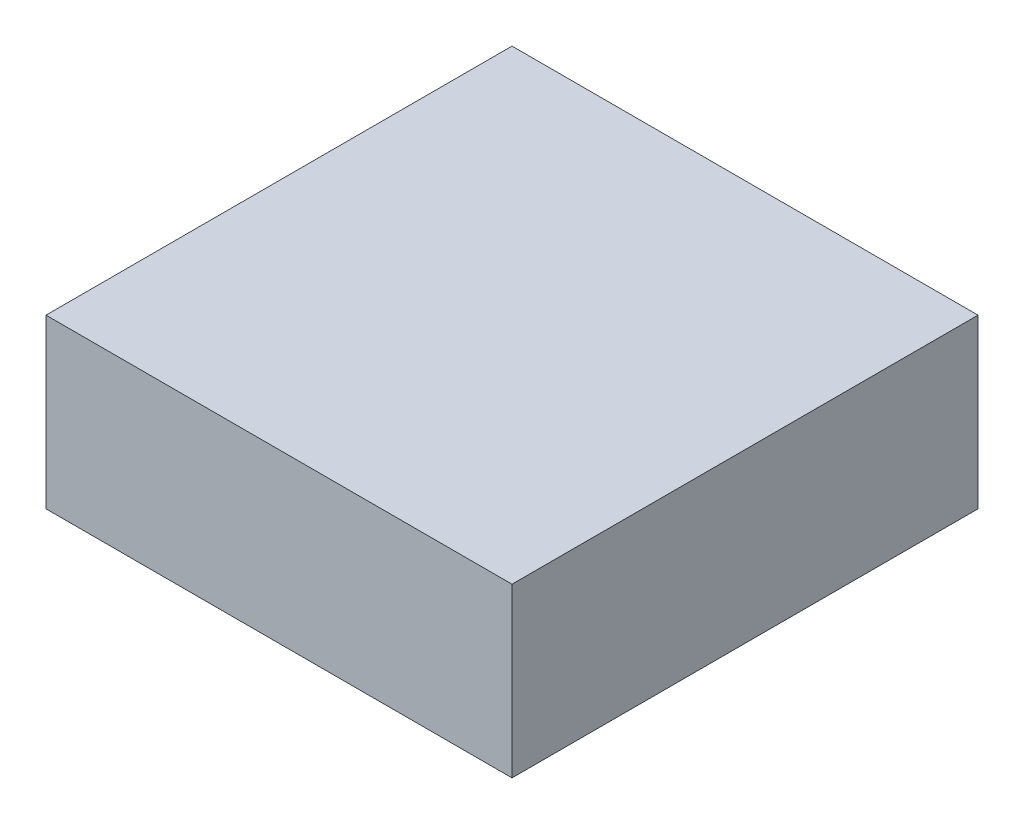
ISO-10303-21;
HEADER;
FILE_DESCRIPTION(('STEP AP214'),'2;1');
FILE_NAME('part.step','',(''),(''),'','','');
FILE_SCHEMA(('AUTOMOTIVE_DESIGN { 1 0 10303 214 1 1 1 1 }'));
ENDSEC;
DATA;
#1=APPLICATION_CONTEXT('core data for automotive mechanical design processes');
#2=APPLICATION_PROTOCOL_DEFINITION('international standard','automotive_design',2000,#1);
#3=PRODUCT_CONTEXT('',#1,'mechanical');
#4=PRODUCT('Part','Part','',(#3));
#5=PRODUCT_RELATED_PRODUCT_CATEGORY('part','',(#4));
#6=PRODUCT_DEFINITION_FORMATION('','',#4);
#7=PRODUCT_DEFINITION_CONTEXT('part definition',#1,'design');
#8=PRODUCT_DEFINITION('design','',#6,#7);
#9=PRODUCT_DEFINITION_SHAPE('','',#8);
#10=(LENGTH_UNIT() NAMED_UNIT(*) SI_UNIT(.MILLI.,.METRE.));
#11=(NAMED_UNIT(*) PLANE_ANGLE_UNIT() SI_UNIT($,.RADIAN.));
#12=(NAMED_UNIT(*) SI_UNIT($,.STERADIAN.) SOLID_ANGLE_UNIT());
#13=UNCERTAINTY_MEASURE_WITH_UNIT(LENGTH_MEASURE(1.E-05),#10,'distance_accuracy_value','');
#14=(GEOMETRIC_REPRESENTATION_CONTEXT(3) GLOBAL_UNCERTAINTY_ASSIGNED_CONTEXT((#13)) GLOBAL_UNIT_ASSIGNED_CONTEXT((#10,
#11,#12)) REPRESENTATION_CONTEXT('',''));
#15=CARTESIAN_POINT('',(0.,0.,0.));
#16=DIRECTION('',(0.,0.,1.));
#17=DIRECTION('',(1.,0.,0.));
#18=AXIS2_PLACEMENT_3D('',#15,#16,#17);
#19=CARTESIAN_POINT('',(12.5,9.,12.5));
#20=DIRECTION('',(-1.,0.,0.));
#21=DIRECTION('',(0.,0.,1.));
#22=AXIS2_PLACEMENT_3D('',#19,#20,#21);
#23=PLANE('',#22);
#24=DIRECTION('',(0.,0.,-1.));
#25=VECTOR('',#24,1.);
#26=CARTESIAN_POINT('',(12.5,0.,12.5));
#27=LINE('',#26,#25);
#28=CARTESIAN_POINT('',(12.5,0.,12.5));
#29=VERTEX_POINT('',#28);
#30=CARTESIAN_POINT('',(12.5,0.,-12.5));
#31=VERTEX_POINT('',#30);
#32=EDGE_CURVE('E96',#29,#31,#27,.T.);
#33=ORIENTED_EDGE('',*,*,#32,.T.);
#34=DIRECTION('',(0.,-1.,0.));
#35=VECTOR('',#34,1.);
#36=CARTESIAN_POINT('',(12.5,9.,-12.5));
#37=LINE('',#36,#35);
#38=CARTESIAN_POINT('',(12.5,9.,-12.5));
#39=VERTEX_POINT('',#38);
#40=EDGE_CURVE('E11',#39,#31,#37,.T.);
#41=ORIENTED_EDGE('',*,*,#40,.F.);
#42=DIRECTION('',(0.,0.,-1.));
#43=VECTOR('',#42,1.);
#44=CARTESIAN_POINT('',(12.5,9.,12.5));
#45=LINE('',#44,#43);
#46=CARTESIAN_POINT('',(12.5,9.,12.5));
#47=VERTEX_POINT('',#46);
#48=EDGE_CURVE('E84',#47,#39,#45,.T.);
#49=ORIENTED_EDGE('',*,*,#48,.F.);
#50=DIRECTION('',(0.,-1.,0.));
#51=VECTOR('',#50,1.);
#52=CARTESIAN_POINT('',(12.5,9.,12.5));
#53=LINE('',#52,#51);
#54=EDGE_CURVE('E92',#47,#29,#53,.T.);
#55=ORIENTED_EDGE('',*,*,#54,.T.);
#56=EDGE_LOOP('',(#33,#41,#49,#55));
#57=FACE_BOUND('',#56,.T.);
#58=ADVANCED_FACE('F33',(#57),#23,.F.);
#59=CARTESIAN_POINT('',(-12.5,9.,-12.5));
#60=DIRECTION('',(0.,0.,1.));
#61=DIRECTION('',(1.,0.,0.));
#62=AXIS2_PLACEMENT_3D('',#59,#60,#61);
#63=PLANE('',#62);
#64=DIRECTION('',(-1.,0.,0.));
#65=VECTOR('',#64,1.);
#66=CARTESIAN_POINT('',(-12.5,0.,-12.5));
#67=LINE('',#66,#65);
#68=CARTESIAN_POINT('',(-12.5,0.,-12.5));
#69=VERTEX_POINT('',#68);
#70=EDGE_CURVE('E88',#31,#69,#67,.T.);
#71=ORIENTED_EDGE('',*,*,#70,.T.);
#72=DIRECTION('',(0.,-1.,0.));
#73=VECTOR('',#72,1.);
#74=CARTESIAN_POINT('',(-12.5,9.,-12.5));
#75=LINE('',#74,#73);
#76=CARTESIAN_POINT('',(-12.5,9.,-12.5));
#77=VERTEX_POINT('',#76);
#78=EDGE_CURVE('E41',#77,#69,#75,.T.);
#79=ORIENTED_EDGE('',*,*,#78,.F.);
#80=DIRECTION('',(-1.,0.,0.));
#81=VECTOR('',#80,1.);
#82=CARTESIAN_POINT('',(-12.5,9.,-12.5));
#83=LINE('',#82,#81);
#84=EDGE_CURVE('E79',#39,#77,#83,.T.);
#85=ORIENTED_EDGE('',*,*,#84,.F.);
#86=ORIENTED_EDGE('',*,*,#40,.T.);
#87=EDGE_LOOP('',(#71,#79,#85,#86));
#88=FACE_BOUND('',#87,.T.);
#89=ADVANCED_FACE('F87',(#88),#63,.F.);
#90=CARTESIAN_POINT('',(-12.5,9.,12.5));
#91=DIRECTION('',(1.,0.,0.));
#92=DIRECTION('',(0.,0.,-1.));
#93=AXIS2_PLACEMENT_3D('',#90,#91,#92);
#94=PLANE('',#93);
#95=DIRECTION('',(0.,0.,1.));
#96=VECTOR('',#95,1.);
#97=CARTESIAN_POINT('',(-12.5,0.,12.5));
#98=LINE('',#97,#96);
#99=CARTESIAN_POINT('',(-12.5,0.,12.5));
#100=VERTEX_POINT('',#99);
#101=EDGE_CURVE('E66',#69,#100,#98,.T.);
#102=ORIENTED_EDGE('',*,*,#101,.T.);
#103=DIRECTION('',(0.,-1.,0.));
#104=VECTOR('',#103,1.);
#105=CARTESIAN_POINT('',(-12.5,9.,12.5));
#106=LINE('',#105,#104);
#107=CARTESIAN_POINT('',(-12.5,9.,12.5));
#108=VERTEX_POINT('',#107);
#109=EDGE_CURVE('E89',#108,#100,#106,.T.);
#110=ORIENTED_EDGE('',*,*,#109,.F.);
#111=DIRECTION('',(0.,0.,1.));
#112=VECTOR('',#111,1.);
#113=CARTESIAN_POINT('',(-12.5,9.,12.5));
#114=LINE('',#113,#112);
#115=EDGE_CURVE('E82',#77,#108,#114,.T.);
#116=ORIENTED_EDGE('',*,*,#115,.F.);
#117=ORIENTED_EDGE('',*,*,#78,.T.);
#118=EDGE_LOOP('',(#102,#110,#116,#117));
#119=FACE_BOUND('',#118,.T.);
#120=ADVANCED_FACE('F90',(#119),#94,.F.);
#121=CARTESIAN_POINT('',(-12.5,9.,12.5));
#122=DIRECTION('',(0.,0.,-1.));
#123=DIRECTION('',(-1.,0.,0.));
#124=AXIS2_PLACEMENT_3D('',#121,#122,#123);
#125=PLANE('',#124);
#126=DIRECTION('',(1.,0.,0.));
#127=VECTOR('',#126,1.);
#128=CARTESIAN_POINT('',(-12.5,0.,12.5));
#129=LINE('',#128,#127);
#130=EDGE_CURVE('E72',#100,#29,#129,.T.);
#131=ORIENTED_EDGE('',*,*,#130,.T.);
#132=ORIENTED_EDGE('',*,*,#54,.F.);
#133=DIRECTION('',(1.,0.,0.));
#134=VECTOR('',#133,1.);
#135=CARTESIAN_POINT('',(-12.5,9.,12.5));
#136=LINE('',#135,#134);
#137=EDGE_CURVE('E49',#108,#47,#136,.T.);
#138=ORIENTED_EDGE('',*,*,#137,.F.);
#139=ORIENTED_EDGE('',*,*,#109,.T.);
#140=EDGE_LOOP('',(#131,#132,#138,#139));
#141=FACE_BOUND('',#140,.T.);
#142=ADVANCED_FACE('F103',(#141),#125,.F.);
#143=CARTESIAN_POINT('',(0.,9.,0.));
#144=DIRECTION('',(0.,-1.,0.));
#145=DIRECTION('',(0.,0.,-1.));
#146=AXIS2_PLACEMENT_3D('',#143,#144,#145);
#147=PLANE('',#146);
#148=ORIENTED_EDGE('',*,*,#48,.T.);
#149=ORIENTED_EDGE('',*,*,#84,.T.);
#150=ORIENTED_EDGE('',*,*,#115,.T.);
#151=ORIENTED_EDGE('',*,*,#137,.T.);
#152=EDGE_LOOP('',(#148,#149,#150,#151));
#153=FACE_BOUND('',#152,.T.);
#154=ADVANCED_FACE('F80',(#153),#147,.F.);
#155=CARTESIAN_POINT('',(0.,0.,0.));
#156=DIRECTION('',(0.,-1.,0.));
#157=DIRECTION('',(0.,0.,-1.));
#158=AXIS2_PLACEMENT_3D('',#155,#156,#157);
#159=PLANE('',#158);
#160=ORIENTED_EDGE('',*,*,#32,.F.);
#161=ORIENTED_EDGE('',*,*,#130,.F.);
#162=ORIENTED_EDGE('',*,*,#101,.F.);
#163=ORIENTED_EDGE('',*,*,#70,.F.);
#164=EDGE_LOOP('',(#160,#161,#162,#163));
#165=FACE_BOUND('',#164,.T.);
#166=ADVANCED_FACE('F106',(#165),#159,.T.);
#167=CLOSED_SHELL('',(#58,#89,#120,#142,#154,#166));
#168=MANIFOLD_SOLID_BREP('B2',#167);
#169=ADVANCED_BREP_SHAPE_REPRESENTATION('',(#18,#168),#14);
#170=SHAPE_DEFINITION_REPRESENTATION(#9,#169);
ENDSEC;
END-ISO-10303-21;
